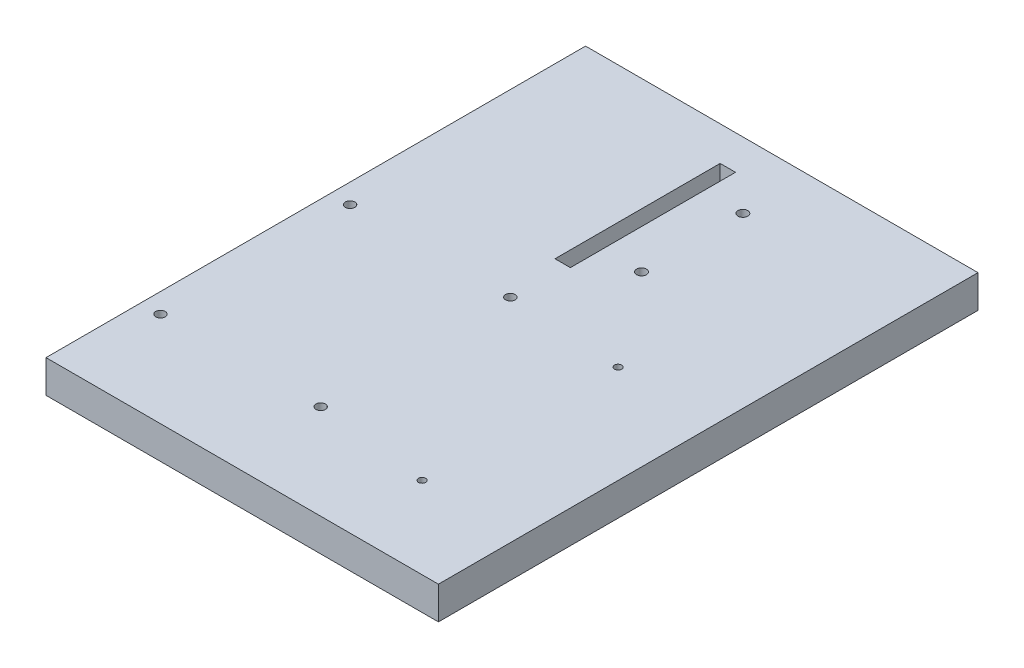
ISO-10303-21;
HEADER;
FILE_DESCRIPTION(('STEP AP214'),'2;1');
FILE_NAME('part.step','',(''),(''),'','','');
FILE_SCHEMA(('AUTOMOTIVE_DESIGN { 1 0 10303 214 1 1 1 1 }'));
ENDSEC;
DATA;
#1=APPLICATION_CONTEXT('core data for automotive mechanical design processes');
#2=APPLICATION_PROTOCOL_DEFINITION('international standard','automotive_design',2000,#1);
#3=PRODUCT_CONTEXT('',#1,'mechanical');
#4=PRODUCT('Part','Part','',(#3));
#5=PRODUCT_RELATED_PRODUCT_CATEGORY('part','',(#4));
#6=PRODUCT_DEFINITION_FORMATION('','',#4);
#7=PRODUCT_DEFINITION_CONTEXT('part definition',#1,'design');
#8=PRODUCT_DEFINITION('design','',#6,#7);
#9=PRODUCT_DEFINITION_SHAPE('','',#8);
#10=(LENGTH_UNIT() NAMED_UNIT(*) SI_UNIT(.MILLI.,.METRE.));
#11=(NAMED_UNIT(*) PLANE_ANGLE_UNIT() SI_UNIT($,.RADIAN.));
#12=(NAMED_UNIT(*) SI_UNIT($,.STERADIAN.) SOLID_ANGLE_UNIT());
#13=UNCERTAINTY_MEASURE_WITH_UNIT(LENGTH_MEASURE(1.E-05),#10,'distance_accuracy_value','');
#14=(GEOMETRIC_REPRESENTATION_CONTEXT(3) GLOBAL_UNCERTAINTY_ASSIGNED_CONTEXT((#13)) GLOBAL_UNIT_ASSIGNED_CONTEXT((#10,
#11,#12)) REPRESENTATION_CONTEXT('',''));
#15=CARTESIAN_POINT('',(0.,0.,0.));
#16=DIRECTION('',(0.,0.,1.));
#17=DIRECTION('',(1.,0.,0.));
#18=AXIS2_PLACEMENT_3D('',#15,#16,#17);
#19=CARTESIAN_POINT('',(0.,10.,0.));
#20=DIRECTION('',(1.,0.,0.));
#21=DIRECTION('',(0.,0.,-1.));
#22=AXIS2_PLACEMENT_3D('',#19,#20,#21);
#23=PLANE('',#22);
#24=DIRECTION('',(0.,0.,1.));
#25=VECTOR('',#24,1.);
#26=CARTESIAN_POINT('',(0.,0.,0.));
#27=LINE('',#26,#25);
#28=CARTESIAN_POINT('',(0.,0.,-165.));
#29=VERTEX_POINT('',#28);
#30=CARTESIAN_POINT('',(0.,0.,0.));
#31=VERTEX_POINT('',#30);
#32=EDGE_CURVE('E226',#29,#31,#27,.T.);
#33=ORIENTED_EDGE('',*,*,#32,.T.);
#34=DIRECTION('',(0.,-1.,0.));
#35=VECTOR('',#34,1.);
#36=CARTESIAN_POINT('',(0.,10.,0.));
#37=LINE('',#36,#35);
#38=CARTESIAN_POINT('',(0.,10.,0.));
#39=VERTEX_POINT('',#38);
#40=EDGE_CURVE('E11',#39,#31,#37,.T.);
#41=ORIENTED_EDGE('',*,*,#40,.F.);
#42=DIRECTION('',(0.,0.,1.));
#43=VECTOR('',#42,1.);
#44=CARTESIAN_POINT('',(0.,10.,0.));
#45=LINE('',#44,#43);
#46=CARTESIAN_POINT('',(0.,10.,-165.));
#47=VERTEX_POINT('',#46);
#48=EDGE_CURVE('E227',#47,#39,#45,.T.);
#49=ORIENTED_EDGE('',*,*,#48,.F.);
#50=DIRECTION('',(0.,-1.,0.));
#51=VECTOR('',#50,1.);
#52=CARTESIAN_POINT('',(0.,10.,-165.));
#53=LINE('',#52,#51);
#54=EDGE_CURVE('E237',#47,#29,#53,.T.);
#55=ORIENTED_EDGE('',*,*,#54,.T.);
#56=EDGE_LOOP('',(#33,#41,#49,#55));
#57=FACE_BOUND('',#56,.T.);
#58=ADVANCED_FACE('F35',(#57),#23,.F.);
#59=CARTESIAN_POINT('',(0.,10.,0.));
#60=DIRECTION('',(0.,0.,-1.));
#61=DIRECTION('',(-1.,0.,0.));
#62=AXIS2_PLACEMENT_3D('',#59,#60,#61);
#63=PLANE('',#62);
#64=DIRECTION('',(1.,0.,0.));
#65=VECTOR('',#64,1.);
#66=CARTESIAN_POINT('',(0.,0.,0.));
#67=LINE('',#66,#65);
#68=CARTESIAN_POINT('',(120.,0.,0.));
#69=VERTEX_POINT('',#68);
#70=EDGE_CURVE('E240',#31,#69,#67,.T.);
#71=ORIENTED_EDGE('',*,*,#70,.T.);
#72=DIRECTION('',(0.,-1.,0.));
#73=VECTOR('',#72,1.);
#74=CARTESIAN_POINT('',(120.,10.,0.));
#75=LINE('',#74,#73);
#76=CARTESIAN_POINT('',(120.,10.,0.));
#77=VERTEX_POINT('',#76);
#78=EDGE_CURVE('E42',#77,#69,#75,.T.);
#79=ORIENTED_EDGE('',*,*,#78,.F.);
#80=DIRECTION('',(1.,0.,0.));
#81=VECTOR('',#80,1.);
#82=CARTESIAN_POINT('',(0.,10.,0.));
#83=LINE('',#82,#81);
#84=EDGE_CURVE('E230',#39,#77,#83,.T.);
#85=ORIENTED_EDGE('',*,*,#84,.F.);
#86=ORIENTED_EDGE('',*,*,#40,.T.);
#87=EDGE_LOOP('',(#71,#79,#85,#86));
#88=FACE_BOUND('',#87,.T.);
#89=ADVANCED_FACE('F269',(#88),#63,.F.);
#90=CARTESIAN_POINT('',(120.,10.,0.));
#91=DIRECTION('',(-1.,0.,0.));
#92=DIRECTION('',(0.,0.,1.));
#93=AXIS2_PLACEMENT_3D('',#90,#91,#92);
#94=PLANE('',#93);
#95=DIRECTION('',(0.,0.,-1.));
#96=VECTOR('',#95,1.);
#97=CARTESIAN_POINT('',(120.,0.,0.));
#98=LINE('',#97,#96);
#99=CARTESIAN_POINT('',(120.,0.,-165.));
#100=VERTEX_POINT('',#99);
#101=EDGE_CURVE('E242',#69,#100,#98,.T.);
#102=ORIENTED_EDGE('',*,*,#101,.T.);
#103=DIRECTION('',(0.,-1.,0.));
#104=VECTOR('',#103,1.);
#105=CARTESIAN_POINT('',(120.,10.,-165.));
#106=LINE('',#105,#104);
#107=CARTESIAN_POINT('',(120.,10.,-165.));
#108=VERTEX_POINT('',#107);
#109=EDGE_CURVE('E247',#108,#100,#106,.T.);
#110=ORIENTED_EDGE('',*,*,#109,.F.);
#111=DIRECTION('',(0.,0.,-1.));
#112=VECTOR('',#111,1.);
#113=CARTESIAN_POINT('',(120.,10.,0.));
#114=LINE('',#113,#112);
#115=EDGE_CURVE('E233',#77,#108,#114,.T.);
#116=ORIENTED_EDGE('',*,*,#115,.F.);
#117=ORIENTED_EDGE('',*,*,#78,.T.);
#118=EDGE_LOOP('',(#102,#110,#116,#117));
#119=FACE_BOUND('',#118,.T.);
#120=ADVANCED_FACE('F254',(#119),#94,.F.);
#121=CARTESIAN_POINT('',(0.,10.,-165.));
#122=DIRECTION('',(0.,0.,1.));
#123=DIRECTION('',(1.,0.,0.));
#124=AXIS2_PLACEMENT_3D('',#121,#122,#123);
#125=PLANE('',#124);
#126=DIRECTION('',(-1.,0.,0.));
#127=VECTOR('',#126,1.);
#128=CARTESIAN_POINT('',(0.,0.,-165.));
#129=LINE('',#128,#127);
#130=EDGE_CURVE('E231',#100,#29,#129,.T.);
#131=ORIENTED_EDGE('',*,*,#130,.T.);
#132=ORIENTED_EDGE('',*,*,#54,.F.);
#133=DIRECTION('',(-1.,0.,0.));
#134=VECTOR('',#133,1.);
#135=CARTESIAN_POINT('',(0.,10.,-165.));
#136=LINE('',#135,#134);
#137=EDGE_CURVE('E235',#108,#47,#136,.T.);
#138=ORIENTED_EDGE('',*,*,#137,.F.);
#139=ORIENTED_EDGE('',*,*,#109,.T.);
#140=EDGE_LOOP('',(#131,#132,#138,#139));
#141=FACE_BOUND('',#140,.T.);
#142=ADVANCED_FACE('F262',(#141),#125,.F.);
#143=CARTESIAN_POINT('',(0.,10.,0.));
#144=DIRECTION('',(0.,-1.,0.));
#145=DIRECTION('',(0.,0.,-1.));
#146=AXIS2_PLACEMENT_3D('',#143,#144,#145);
#147=PLANE('',#146);
#148=CARTESIAN_POINT('',(68.35,10.,-144.75));
#149=DIRECTION('',(0.,1.,0.));
#150=DIRECTION('',(0.,0.,1.));
#151=AXIS2_PLACEMENT_3D('',#148,#149,#150);
#152=CIRCLE('',#151,1.5);
#153=CARTESIAN_POINT('',(68.35,10.,-143.25));
#154=VERTEX_POINT('',#153);
#155=EDGE_CURVE('E403',#154,#154,#152,.T.);
#156=ORIENTED_EDGE('',*,*,#155,.F.);
#157=EDGE_LOOP('',(#156));
#158=FACE_BOUND('',#157,.T.);
#159=CARTESIAN_POINT('',(68.35,10.,-113.75));
#160=DIRECTION('',(0.,1.,0.));
#161=DIRECTION('',(0.,0.,1.));
#162=AXIS2_PLACEMENT_3D('',#159,#160,#161);
#163=CIRCLE('',#162,1.5);
#164=CARTESIAN_POINT('',(68.35,10.,-112.25));
#165=VERTEX_POINT('',#164);
#166=EDGE_CURVE('E411',#165,#165,#163,.T.);
#167=ORIENTED_EDGE('',*,*,#166,.F.);
#168=EDGE_LOOP('',(#167));
#169=FACE_BOUND('',#168,.T.);
#170=DIRECTION('',(0.,0.,-1.));
#171=VECTOR('',#170,1.);
#172=CARTESIAN_POINT('',(56.35,10.,-154.5));
#173=LINE('',#172,#171);
#174=CARTESIAN_POINT('',(56.35,10.,-104.));
#175=VERTEX_POINT('',#174);
#176=CARTESIAN_POINT('',(56.35,10.,-154.5));
#177=VERTEX_POINT('',#176);
#178=EDGE_CURVE('E123',#175,#177,#173,.T.);
#179=ORIENTED_EDGE('',*,*,#178,.F.);
#180=DIRECTION('',(1.,0.,0.));
#181=VECTOR('',#180,1.);
#182=CARTESIAN_POINT('',(51.65,10.,-104.));
#183=LINE('',#182,#181);
#184=CARTESIAN_POINT('',(51.65,10.,-104.));
#185=VERTEX_POINT('',#184);
#186=EDGE_CURVE('E116',#185,#175,#183,.T.);
#187=ORIENTED_EDGE('',*,*,#186,.F.);
#188=DIRECTION('',(0.,0.,1.));
#189=VECTOR('',#188,1.);
#190=CARTESIAN_POINT('',(51.65,10.,-154.5));
#191=LINE('',#190,#189);
#192=CARTESIAN_POINT('',(51.65,10.,-154.5));
#193=VERTEX_POINT('',#192);
#194=EDGE_CURVE('E127',#193,#185,#191,.T.);
#195=ORIENTED_EDGE('',*,*,#194,.F.);
#196=DIRECTION('',(-1.,0.,0.));
#197=VECTOR('',#196,1.);
#198=CARTESIAN_POINT('',(51.65,10.,-154.5));
#199=LINE('',#198,#197);
#200=EDGE_CURVE('E49',#177,#193,#199,.T.);
#201=ORIENTED_EDGE('',*,*,#200,.F.);
#202=EDGE_LOOP('',(#179,#187,#195,#201));
#203=FACE_BOUND('',#202,.T.);
#204=CARTESIAN_POINT('',(90.,10.,-25.));
#205=DIRECTION('',(0.,-1.,0.));
#206=DIRECTION('',(0.,0.,-1.));
#207=AXIS2_PLACEMENT_3D('',#204,#205,#206);
#208=CIRCLE('',#207,1.1);
#209=CARTESIAN_POINT('',(90.,10.,-26.1));
#210=VERTEX_POINT('',#209);
#211=EDGE_CURVE('E148',#210,#210,#208,.T.);
#212=ORIENTED_EDGE('',*,*,#211,.T.);
#213=EDGE_LOOP('',(#212));
#214=FACE_BOUND('',#213,.T.);
#215=CARTESIAN_POINT('',(90.,10.,-84.95));
#216=DIRECTION('',(0.,-1.,0.));
#217=DIRECTION('',(0.,0.,-1.));
#218=AXIS2_PLACEMENT_3D('',#215,#216,#217);
#219=CIRCLE('',#218,1.1);
#220=CARTESIAN_POINT('',(90.,10.,-86.05));
#221=VERTEX_POINT('',#220);
#222=EDGE_CURVE('E163',#221,#221,#219,.T.);
#223=ORIENTED_EDGE('',*,*,#222,.T.);
#224=EDGE_LOOP('',(#223));
#225=FACE_BOUND('',#224,.T.);
#226=CARTESIAN_POINT('',(6.,10.,-29.));
#227=DIRECTION('',(0.,-1.,0.));
#228=DIRECTION('',(0.,0.,-1.));
#229=AXIS2_PLACEMENT_3D('',#226,#227,#228);
#230=CIRCLE('',#229,1.45);
#231=CARTESIAN_POINT('',(6.,10.,-30.45));
#232=VERTEX_POINT('',#231);
#233=EDGE_CURVE('E178',#232,#232,#230,.T.);
#234=ORIENTED_EDGE('',*,*,#233,.T.);
#235=EDGE_LOOP('',(#234));
#236=FACE_BOUND('',#235,.T.);
#237=CARTESIAN_POINT('',(55.,10.,-29.));
#238=DIRECTION('',(0.,-1.,0.));
#239=DIRECTION('',(0.,0.,-1.));
#240=AXIS2_PLACEMENT_3D('',#237,#238,#239);
#241=CIRCLE('',#240,1.45);
#242=CARTESIAN_POINT('',(55.,10.,-30.45));
#243=VERTEX_POINT('',#242);
#244=EDGE_CURVE('E193',#243,#243,#241,.T.);
#245=ORIENTED_EDGE('',*,*,#244,.T.);
#246=EDGE_LOOP('',(#245));
#247=FACE_BOUND('',#246,.T.);
#248=CARTESIAN_POINT('',(55.,10.,-87.));
#249=DIRECTION('',(0.,-1.,0.));
#250=DIRECTION('',(0.,0.,-1.));
#251=AXIS2_PLACEMENT_3D('',#248,#249,#250);
#252=CIRCLE('',#251,1.45);
#253=CARTESIAN_POINT('',(55.,10.,-88.45));
#254=VERTEX_POINT('',#253);
#255=EDGE_CURVE('E208',#254,#254,#252,.T.);
#256=ORIENTED_EDGE('',*,*,#255,.T.);
#257=EDGE_LOOP('',(#256));
#258=FACE_BOUND('',#257,.T.);
#259=CARTESIAN_POINT('',(5.99999999999999,10.,-87.));
#260=DIRECTION('',(0.,-1.,0.));
#261=DIRECTION('',(0.,0.,-1.));
#262=AXIS2_PLACEMENT_3D('',#259,#260,#261);
#263=CIRCLE('',#262,1.45);
#264=CARTESIAN_POINT('',(5.99999999999999,10.,-88.45));
#265=VERTEX_POINT('',#264);
#266=EDGE_CURVE('E223',#265,#265,#263,.T.);
#267=ORIENTED_EDGE('',*,*,#266,.T.);
#268=EDGE_LOOP('',(#267));
#269=FACE_BOUND('',#268,.T.);
#270=ORIENTED_EDGE('',*,*,#48,.T.);
#271=ORIENTED_EDGE('',*,*,#84,.T.);
#272=ORIENTED_EDGE('',*,*,#115,.T.);
#273=ORIENTED_EDGE('',*,*,#137,.T.);
#274=EDGE_LOOP('',(#270,#271,#272,#273));
#275=FACE_BOUND('',#274,.T.);
#276=ADVANCED_FACE('F268',(#158,#169,#203,#214,#225,#236,#247,#258,#269,#275),#147,.F.);
#277=CARTESIAN_POINT('',(0.,0.,0.));
#278=DIRECTION('',(0.,-1.,0.));
#279=DIRECTION('',(0.,0.,-1.));
#280=AXIS2_PLACEMENT_3D('',#277,#278,#279);
#281=PLANE('',#280);
#282=CARTESIAN_POINT('',(68.35,0.,-144.75));
#283=DIRECTION('',(0.,-1.,0.));
#284=DIRECTION('',(0.,0.,-1.));
#285=AXIS2_PLACEMENT_3D('',#282,#283,#284);
#286=CIRCLE('',#285,1.5);
#287=CARTESIAN_POINT('',(68.35,0.,-146.25));
#288=VERTEX_POINT('',#287);
#289=EDGE_CURVE('E406',#288,#288,#286,.F.);
#290=ORIENTED_EDGE('',*,*,#289,.T.);
#291=EDGE_LOOP('',(#290));
#292=FACE_BOUND('',#291,.T.);
#293=CARTESIAN_POINT('',(68.35,0.,-113.75));
#294=DIRECTION('',(0.,-1.,0.));
#295=DIRECTION('',(0.,0.,-1.));
#296=AXIS2_PLACEMENT_3D('',#293,#294,#295);
#297=CIRCLE('',#296,1.5);
#298=CARTESIAN_POINT('',(68.35,0.,-115.25));
#299=VERTEX_POINT('',#298);
#300=EDGE_CURVE('E408',#299,#299,#297,.F.);
#301=ORIENTED_EDGE('',*,*,#300,.T.);
#302=EDGE_LOOP('',(#301));
#303=FACE_BOUND('',#302,.T.);
#304=DIRECTION('',(1.,0.,0.));
#305=VECTOR('',#304,1.);
#306=CARTESIAN_POINT('',(51.65,0.,-104.));
#307=LINE('',#306,#305);
#308=CARTESIAN_POINT('',(51.65,0.,-104.));
#309=VERTEX_POINT('',#308);
#310=CARTESIAN_POINT('',(56.35,0.,-104.));
#311=VERTEX_POINT('',#310);
#312=EDGE_CURVE('E113',#309,#311,#307,.T.);
#313=ORIENTED_EDGE('',*,*,#312,.T.);
#314=DIRECTION('',(0.,0.,-1.));
#315=VECTOR('',#314,1.);
#316=CARTESIAN_POINT('',(56.35,0.,-154.5));
#317=LINE('',#316,#315);
#318=CARTESIAN_POINT('',(56.35,0.,-154.5));
#319=VERTEX_POINT('',#318);
#320=EDGE_CURVE('E100',#311,#319,#317,.T.);
#321=ORIENTED_EDGE('',*,*,#320,.T.);
#322=DIRECTION('',(-1.,0.,0.));
#323=VECTOR('',#322,1.);
#324=CARTESIAN_POINT('',(51.65,0.,-154.5));
#325=LINE('',#324,#323);
#326=CARTESIAN_POINT('',(51.65,0.,-154.5));
#327=VERTEX_POINT('',#326);
#328=EDGE_CURVE('E131',#319,#327,#325,.T.);
#329=ORIENTED_EDGE('',*,*,#328,.T.);
#330=DIRECTION('',(0.,0.,1.));
#331=VECTOR('',#330,1.);
#332=CARTESIAN_POINT('',(51.65,0.,-154.5));
#333=LINE('',#332,#331);
#334=EDGE_CURVE('E121',#327,#309,#333,.T.);
#335=ORIENTED_EDGE('',*,*,#334,.T.);
#336=EDGE_LOOP('',(#313,#321,#329,#335));
#337=FACE_BOUND('',#336,.T.);
#338=CARTESIAN_POINT('',(90.,0.,-25.));
#339=DIRECTION('',(0.,-1.,0.));
#340=DIRECTION('',(0.,0.,-1.));
#341=AXIS2_PLACEMENT_3D('',#338,#339,#340);
#342=CIRCLE('',#341,2.525);
#343=CARTESIAN_POINT('',(90.,0.,-27.525));
#344=VERTEX_POINT('',#343);
#345=EDGE_CURVE('E136',#344,#344,#342,.T.);
#346=ORIENTED_EDGE('',*,*,#345,.F.);
#347=EDGE_LOOP('',(#346));
#348=FACE_BOUND('',#347,.T.);
#349=CARTESIAN_POINT('',(90.,0.,-84.95));
#350=DIRECTION('',(0.,-1.,0.));
#351=DIRECTION('',(0.,0.,-1.));
#352=AXIS2_PLACEMENT_3D('',#349,#350,#351);
#353=CIRCLE('',#352,2.525);
#354=CARTESIAN_POINT('',(90.,0.,-87.475));
#355=VERTEX_POINT('',#354);
#356=EDGE_CURVE('E151',#355,#355,#353,.T.);
#357=ORIENTED_EDGE('',*,*,#356,.F.);
#358=EDGE_LOOP('',(#357));
#359=FACE_BOUND('',#358,.T.);
#360=CARTESIAN_POINT('',(6.,0.,-29.));
#361=DIRECTION('',(0.,-1.,0.));
#362=DIRECTION('',(0.,0.,-1.));
#363=AXIS2_PLACEMENT_3D('',#360,#361,#362);
#364=CIRCLE('',#363,3.025);
#365=CARTESIAN_POINT('',(6.,0.,-32.025));
#366=VERTEX_POINT('',#365);
#367=EDGE_CURVE('E166',#366,#366,#364,.T.);
#368=ORIENTED_EDGE('',*,*,#367,.F.);
#369=EDGE_LOOP('',(#368));
#370=FACE_BOUND('',#369,.T.);
#371=CARTESIAN_POINT('',(55.,0.,-29.));
#372=DIRECTION('',(0.,-1.,0.));
#373=DIRECTION('',(0.,0.,-1.));
#374=AXIS2_PLACEMENT_3D('',#371,#372,#373);
#375=CIRCLE('',#374,3.025);
#376=CARTESIAN_POINT('',(55.,0.,-32.025));
#377=VERTEX_POINT('',#376);
#378=EDGE_CURVE('E181',#377,#377,#375,.T.);
#379=ORIENTED_EDGE('',*,*,#378,.F.);
#380=EDGE_LOOP('',(#379));
#381=FACE_BOUND('',#380,.T.);
#382=CARTESIAN_POINT('',(55.,0.,-87.));
#383=DIRECTION('',(0.,-1.,0.));
#384=DIRECTION('',(0.,0.,-1.));
#385=AXIS2_PLACEMENT_3D('',#382,#383,#384);
#386=CIRCLE('',#385,3.025);
#387=CARTESIAN_POINT('',(55.,0.,-90.025));
#388=VERTEX_POINT('',#387);
#389=EDGE_CURVE('E196',#388,#388,#386,.T.);
#390=ORIENTED_EDGE('',*,*,#389,.F.);
#391=EDGE_LOOP('',(#390));
#392=FACE_BOUND('',#391,.T.);
#393=CARTESIAN_POINT('',(5.99999999999999,0.,-87.));
#394=DIRECTION('',(0.,-1.,0.));
#395=DIRECTION('',(0.,0.,-1.));
#396=AXIS2_PLACEMENT_3D('',#393,#394,#395);
#397=CIRCLE('',#396,3.025);
#398=CARTESIAN_POINT('',(5.99999999999999,0.,-90.025));
#399=VERTEX_POINT('',#398);
#400=EDGE_CURVE('E211',#399,#399,#397,.T.);
#401=ORIENTED_EDGE('',*,*,#400,.F.);
#402=EDGE_LOOP('',(#401));
#403=FACE_BOUND('',#402,.T.);
#404=ORIENTED_EDGE('',*,*,#32,.F.);
#405=ORIENTED_EDGE('',*,*,#130,.F.);
#406=ORIENTED_EDGE('',*,*,#101,.F.);
#407=ORIENTED_EDGE('',*,*,#70,.F.);
#408=EDGE_LOOP('',(#404,#405,#406,#407));
#409=FACE_BOUND('',#408,.T.);
#410=ADVANCED_FACE('F119',(#292,#303,#337,#348,#359,#370,#381,#392,#403,#409),#281,.T.);
#411=CARTESIAN_POINT('',(5.99999999999999,0.,-87.));
#412=DIRECTION('',(0.,-1.,0.));
#413=DIRECTION('',(0.,0.,-1.));
#414=AXIS2_PLACEMENT_3D('',#411,#412,#413);
#415=CYLINDRICAL_SURFACE('',#414,1.45);
#416=ORIENTED_EDGE('',*,*,#266,.F.);
#417=EDGE_LOOP('',(#416));
#418=FACE_BOUND('',#417,.T.);
#419=CARTESIAN_POINT('',(5.99999999999999,2.1,-87.));
#420=DIRECTION('',(0.,-1.,0.));
#421=DIRECTION('',(0.,0.,-1.));
#422=AXIS2_PLACEMENT_3D('',#419,#420,#421);
#423=CIRCLE('',#422,1.45);
#424=CARTESIAN_POINT('',(5.99999999999999,2.1,-88.45));
#425=VERTEX_POINT('',#424);
#426=EDGE_CURVE('E220',#425,#425,#423,.T.);
#427=ORIENTED_EDGE('',*,*,#426,.T.);
#428=EDGE_LOOP('',(#427));
#429=FACE_BOUND('',#428,.T.);
#430=ADVANCED_FACE('F281',(#418,#429),#415,.F.);
#431=CARTESIAN_POINT('',(8.99999999999999,2.1,-87.));
#432=DIRECTION('',(0.,1.,0.));
#433=DIRECTION('',(0.,0.,1.));
#434=AXIS2_PLACEMENT_3D('',#431,#432,#433);
#435=PLANE('',#434);
#436=ORIENTED_EDGE('',*,*,#426,.F.);
#437=EDGE_LOOP('',(#436));
#438=FACE_BOUND('',#437,.T.);
#439=CARTESIAN_POINT('',(5.99999999999999,2.1,-87.));
#440=DIRECTION('',(0.,-1.,0.));
#441=DIRECTION('',(0.,0.,-1.));
#442=AXIS2_PLACEMENT_3D('',#439,#440,#441);
#443=CIRCLE('',#442,3.);
#444=CARTESIAN_POINT('',(5.99999999999999,2.1,-90.));
#445=VERTEX_POINT('',#444);
#446=EDGE_CURVE('E217',#445,#445,#443,.T.);
#447=ORIENTED_EDGE('',*,*,#446,.T.);
#448=EDGE_LOOP('',(#447));
#449=FACE_BOUND('',#448,.T.);
#450=ADVANCED_FACE('F288',(#438,#449),#435,.F.);
#451=CARTESIAN_POINT('',(5.99999999999999,0.,-87.));
#452=DIRECTION('',(0.,-1.,0.));
#453=DIRECTION('',(0.,0.,-1.));
#454=AXIS2_PLACEMENT_3D('',#451,#452,#453);
#455=CYLINDRICAL_SURFACE('',#454,3.);
#456=ORIENTED_EDGE('',*,*,#446,.F.);
#457=EDGE_LOOP('',(#456));
#458=FACE_BOUND('',#457,.T.);
#459=CARTESIAN_POINT('',(5.99999999999999,0.0250000000000002,-87.));
#460=DIRECTION('',(0.,-1.,0.));
#461=DIRECTION('',(0.,0.,-1.));
#462=AXIS2_PLACEMENT_3D('',#459,#460,#461);
#463=CIRCLE('',#462,3.);
#464=CARTESIAN_POINT('',(5.99999999999999,0.0250000000000002,-90.));
#465=VERTEX_POINT('',#464);
#466=EDGE_CURVE('E214',#465,#465,#463,.T.);
#467=ORIENTED_EDGE('',*,*,#466,.T.);
#468=EDGE_LOOP('',(#467));
#469=FACE_BOUND('',#468,.T.);
#470=ADVANCED_FACE('F292',(#458,#469),#455,.F.);
#471=CARTESIAN_POINT('',(5.99999999999999,0.,-87.));
#472=DIRECTION('',(0.,-1.,0.));
#473=DIRECTION('',(0.,0.,-1.));
#474=AXIS2_PLACEMENT_3D('',#471,#472,#473);
#475=CONICAL_SURFACE('',#474,3.025,0.785398163397458);
#476=ORIENTED_EDGE('',*,*,#466,.F.);
#477=EDGE_LOOP('',(#476));
#478=FACE_BOUND('',#477,.T.);
#479=ORIENTED_EDGE('',*,*,#400,.T.);
#480=EDGE_LOOP('',(#479));
#481=FACE_BOUND('',#480,.T.);
#482=ADVANCED_FACE('F296',(#478,#481),#475,.F.);
#483=CARTESIAN_POINT('',(55.,0.,-87.));
#484=DIRECTION('',(0.,-1.,0.));
#485=DIRECTION('',(0.,0.,-1.));
#486=AXIS2_PLACEMENT_3D('',#483,#484,#485);
#487=CYLINDRICAL_SURFACE('',#486,1.45);
#488=ORIENTED_EDGE('',*,*,#255,.F.);
#489=EDGE_LOOP('',(#488));
#490=FACE_BOUND('',#489,.T.);
#491=CARTESIAN_POINT('',(55.,2.1,-87.));
#492=DIRECTION('',(0.,-1.,0.));
#493=DIRECTION('',(0.,0.,-1.));
#494=AXIS2_PLACEMENT_3D('',#491,#492,#493);
#495=CIRCLE('',#494,1.45);
#496=CARTESIAN_POINT('',(55.,2.1,-88.45));
#497=VERTEX_POINT('',#496);
#498=EDGE_CURVE('E205',#497,#497,#495,.T.);
#499=ORIENTED_EDGE('',*,*,#498,.T.);
#500=EDGE_LOOP('',(#499));
#501=FACE_BOUND('',#500,.T.);
#502=ADVANCED_FACE('F300',(#490,#501),#487,.F.);
#503=CARTESIAN_POINT('',(58.,2.1,-87.));
#504=DIRECTION('',(0.,1.,0.));
#505=DIRECTION('',(0.,0.,1.));
#506=AXIS2_PLACEMENT_3D('',#503,#504,#505);
#507=PLANE('',#506);
#508=ORIENTED_EDGE('',*,*,#498,.F.);
#509=EDGE_LOOP('',(#508));
#510=FACE_BOUND('',#509,.T.);
#511=CARTESIAN_POINT('',(55.,2.1,-87.));
#512=DIRECTION('',(0.,-1.,0.));
#513=DIRECTION('',(0.,0.,-1.));
#514=AXIS2_PLACEMENT_3D('',#511,#512,#513);
#515=CIRCLE('',#514,3.);
#516=CARTESIAN_POINT('',(55.,2.1,-90.));
#517=VERTEX_POINT('',#516);
#518=EDGE_CURVE('E202',#517,#517,#515,.T.);
#519=ORIENTED_EDGE('',*,*,#518,.T.);
#520=EDGE_LOOP('',(#519));
#521=FACE_BOUND('',#520,.T.);
#522=ADVANCED_FACE('F304',(#510,#521),#507,.F.);
#523=CARTESIAN_POINT('',(55.,0.,-87.));
#524=DIRECTION('',(0.,-1.,0.));
#525=DIRECTION('',(0.,0.,-1.));
#526=AXIS2_PLACEMENT_3D('',#523,#524,#525);
#527=CYLINDRICAL_SURFACE('',#526,3.);
#528=ORIENTED_EDGE('',*,*,#518,.F.);
#529=EDGE_LOOP('',(#528));
#530=FACE_BOUND('',#529,.T.);
#531=CARTESIAN_POINT('',(55.,0.0250000000000002,-87.));
#532=DIRECTION('',(0.,-1.,0.));
#533=DIRECTION('',(0.,0.,-1.));
#534=AXIS2_PLACEMENT_3D('',#531,#532,#533);
#535=CIRCLE('',#534,3.);
#536=CARTESIAN_POINT('',(55.,0.0250000000000002,-90.));
#537=VERTEX_POINT('',#536);
#538=EDGE_CURVE('E199',#537,#537,#535,.T.);
#539=ORIENTED_EDGE('',*,*,#538,.T.);
#540=EDGE_LOOP('',(#539));
#541=FACE_BOUND('',#540,.T.);
#542=ADVANCED_FACE('F308',(#530,#541),#527,.F.);
#543=CARTESIAN_POINT('',(55.,0.,-87.));
#544=DIRECTION('',(0.,-1.,0.));
#545=DIRECTION('',(0.,0.,-1.));
#546=AXIS2_PLACEMENT_3D('',#543,#544,#545);
#547=CONICAL_SURFACE('',#546,3.025,0.785398163397389);
#548=ORIENTED_EDGE('',*,*,#538,.F.);
#549=EDGE_LOOP('',(#548));
#550=FACE_BOUND('',#549,.T.);
#551=ORIENTED_EDGE('',*,*,#389,.T.);
#552=EDGE_LOOP('',(#551));
#553=FACE_BOUND('',#552,.T.);
#554=ADVANCED_FACE('F312',(#550,#553),#547,.F.);
#555=CARTESIAN_POINT('',(55.,0.,-29.));
#556=DIRECTION('',(0.,-1.,0.));
#557=DIRECTION('',(0.,0.,-1.));
#558=AXIS2_PLACEMENT_3D('',#555,#556,#557);
#559=CYLINDRICAL_SURFACE('',#558,1.45);
#560=ORIENTED_EDGE('',*,*,#244,.F.);
#561=EDGE_LOOP('',(#560));
#562=FACE_BOUND('',#561,.T.);
#563=CARTESIAN_POINT('',(55.,2.1,-29.));
#564=DIRECTION('',(0.,-1.,0.));
#565=DIRECTION('',(0.,0.,-1.));
#566=AXIS2_PLACEMENT_3D('',#563,#564,#565);
#567=CIRCLE('',#566,1.45);
#568=CARTESIAN_POINT('',(55.,2.1,-30.45));
#569=VERTEX_POINT('',#568);
#570=EDGE_CURVE('E190',#569,#569,#567,.T.);
#571=ORIENTED_EDGE('',*,*,#570,.T.);
#572=EDGE_LOOP('',(#571));
#573=FACE_BOUND('',#572,.T.);
#574=ADVANCED_FACE('F316',(#562,#573),#559,.F.);
#575=CARTESIAN_POINT('',(58.,2.1,-29.));
#576=DIRECTION('',(0.,1.,0.));
#577=DIRECTION('',(0.,0.,1.));
#578=AXIS2_PLACEMENT_3D('',#575,#576,#577);
#579=PLANE('',#578);
#580=ORIENTED_EDGE('',*,*,#570,.F.);
#581=EDGE_LOOP('',(#580));
#582=FACE_BOUND('',#581,.T.);
#583=CARTESIAN_POINT('',(55.,2.1,-29.));
#584=DIRECTION('',(0.,-1.,0.));
#585=DIRECTION('',(0.,0.,-1.));
#586=AXIS2_PLACEMENT_3D('',#583,#584,#585);
#587=CIRCLE('',#586,3.);
#588=CARTESIAN_POINT('',(55.,2.1,-32.));
#589=VERTEX_POINT('',#588);
#590=EDGE_CURVE('E187',#589,#589,#587,.T.);
#591=ORIENTED_EDGE('',*,*,#590,.T.);
#592=EDGE_LOOP('',(#591));
#593=FACE_BOUND('',#592,.T.);
#594=ADVANCED_FACE('F320',(#582,#593),#579,.F.);
#595=CARTESIAN_POINT('',(55.,0.,-29.));
#596=DIRECTION('',(0.,-1.,0.));
#597=DIRECTION('',(0.,0.,-1.));
#598=AXIS2_PLACEMENT_3D('',#595,#596,#597);
#599=CYLINDRICAL_SURFACE('',#598,3.);
#600=ORIENTED_EDGE('',*,*,#590,.F.);
#601=EDGE_LOOP('',(#600));
#602=FACE_BOUND('',#601,.T.);
#603=CARTESIAN_POINT('',(55.,0.0250000000000002,-29.));
#604=DIRECTION('',(0.,-1.,0.));
#605=DIRECTION('',(0.,0.,-1.));
#606=AXIS2_PLACEMENT_3D('',#603,#604,#605);
#607=CIRCLE('',#606,3.);
#608=CARTESIAN_POINT('',(55.,0.0250000000000002,-32.));
#609=VERTEX_POINT('',#608);
#610=EDGE_CURVE('E184',#609,#609,#607,.T.);
#611=ORIENTED_EDGE('',*,*,#610,.T.);
#612=EDGE_LOOP('',(#611));
#613=FACE_BOUND('',#612,.T.);
#614=ADVANCED_FACE('F324',(#602,#613),#599,.F.);
#615=CARTESIAN_POINT('',(55.,0.,-29.));
#616=DIRECTION('',(0.,-1.,0.));
#617=DIRECTION('',(0.,0.,-1.));
#618=AXIS2_PLACEMENT_3D('',#615,#616,#617);
#619=CONICAL_SURFACE('',#618,3.025,0.785398163397389);
#620=ORIENTED_EDGE('',*,*,#610,.F.);
#621=EDGE_LOOP('',(#620));
#622=FACE_BOUND('',#621,.T.);
#623=ORIENTED_EDGE('',*,*,#378,.T.);
#624=EDGE_LOOP('',(#623));
#625=FACE_BOUND('',#624,.T.);
#626=ADVANCED_FACE('F328',(#622,#625),#619,.F.);
#627=CARTESIAN_POINT('',(6.,0.,-29.));
#628=DIRECTION('',(0.,-1.,0.));
#629=DIRECTION('',(0.,0.,-1.));
#630=AXIS2_PLACEMENT_3D('',#627,#628,#629);
#631=CYLINDRICAL_SURFACE('',#630,1.45);
#632=ORIENTED_EDGE('',*,*,#233,.F.);
#633=EDGE_LOOP('',(#632));
#634=FACE_BOUND('',#633,.T.);
#635=CARTESIAN_POINT('',(6.,2.1,-29.));
#636=DIRECTION('',(0.,-1.,0.));
#637=DIRECTION('',(0.,0.,-1.));
#638=AXIS2_PLACEMENT_3D('',#635,#636,#637);
#639=CIRCLE('',#638,1.45);
#640=CARTESIAN_POINT('',(6.,2.1,-30.45));
#641=VERTEX_POINT('',#640);
#642=EDGE_CURVE('E175',#641,#641,#639,.T.);
#643=ORIENTED_EDGE('',*,*,#642,.T.);
#644=EDGE_LOOP('',(#643));
#645=FACE_BOUND('',#644,.T.);
#646=ADVANCED_FACE('F332',(#634,#645),#631,.F.);
#647=CARTESIAN_POINT('',(9.,2.1,-29.));
#648=DIRECTION('',(0.,1.,0.));
#649=DIRECTION('',(0.,0.,1.));
#650=AXIS2_PLACEMENT_3D('',#647,#648,#649);
#651=PLANE('',#650);
#652=ORIENTED_EDGE('',*,*,#642,.F.);
#653=EDGE_LOOP('',(#652));
#654=FACE_BOUND('',#653,.T.);
#655=CARTESIAN_POINT('',(6.,2.1,-29.));
#656=DIRECTION('',(0.,-1.,0.));
#657=DIRECTION('',(0.,0.,-1.));
#658=AXIS2_PLACEMENT_3D('',#655,#656,#657);
#659=CIRCLE('',#658,3.);
#660=CARTESIAN_POINT('',(6.,2.1,-32.));
#661=VERTEX_POINT('',#660);
#662=EDGE_CURVE('E172',#661,#661,#659,.T.);
#663=ORIENTED_EDGE('',*,*,#662,.T.);
#664=EDGE_LOOP('',(#663));
#665=FACE_BOUND('',#664,.T.);
#666=ADVANCED_FACE('F336',(#654,#665),#651,.F.);
#667=CARTESIAN_POINT('',(6.,0.,-29.));
#668=DIRECTION('',(0.,-1.,0.));
#669=DIRECTION('',(0.,0.,-1.));
#670=AXIS2_PLACEMENT_3D('',#667,#668,#669);
#671=CYLINDRICAL_SURFACE('',#670,3.);
#672=ORIENTED_EDGE('',*,*,#662,.F.);
#673=EDGE_LOOP('',(#672));
#674=FACE_BOUND('',#673,.T.);
#675=CARTESIAN_POINT('',(6.,0.0250000000000002,-29.));
#676=DIRECTION('',(0.,-1.,0.));
#677=DIRECTION('',(0.,0.,-1.));
#678=AXIS2_PLACEMENT_3D('',#675,#676,#677);
#679=CIRCLE('',#678,3.);
#680=CARTESIAN_POINT('',(6.,0.0250000000000002,-32.));
#681=VERTEX_POINT('',#680);
#682=EDGE_CURVE('E169',#681,#681,#679,.T.);
#683=ORIENTED_EDGE('',*,*,#682,.T.);
#684=EDGE_LOOP('',(#683));
#685=FACE_BOUND('',#684,.T.);
#686=ADVANCED_FACE('F340',(#674,#685),#671,.F.);
#687=CARTESIAN_POINT('',(6.,0.,-29.));
#688=DIRECTION('',(0.,-1.,0.));
#689=DIRECTION('',(0.,0.,-1.));
#690=AXIS2_PLACEMENT_3D('',#687,#688,#689);
#691=CONICAL_SURFACE('',#690,3.025,0.785398163397458);
#692=ORIENTED_EDGE('',*,*,#682,.F.);
#693=EDGE_LOOP('',(#692));
#694=FACE_BOUND('',#693,.T.);
#695=ORIENTED_EDGE('',*,*,#367,.T.);
#696=EDGE_LOOP('',(#695));
#697=FACE_BOUND('',#696,.T.);
#698=ADVANCED_FACE('F344',(#694,#697),#691,.F.);
#699=CARTESIAN_POINT('',(90.,0.,-84.95));
#700=DIRECTION('',(0.,-1.,0.));
#701=DIRECTION('',(0.,0.,-1.));
#702=AXIS2_PLACEMENT_3D('',#699,#700,#701);
#703=CYLINDRICAL_SURFACE('',#702,1.1);
#704=ORIENTED_EDGE('',*,*,#222,.F.);
#705=EDGE_LOOP('',(#704));
#706=FACE_BOUND('',#705,.T.);
#707=CARTESIAN_POINT('',(90.,1.6,-84.95));
#708=DIRECTION('',(0.,-1.,0.));
#709=DIRECTION('',(0.,0.,-1.));
#710=AXIS2_PLACEMENT_3D('',#707,#708,#709);
#711=CIRCLE('',#710,1.1);
#712=CARTESIAN_POINT('',(90.,1.6,-86.05));
#713=VERTEX_POINT('',#712);
#714=EDGE_CURVE('E160',#713,#713,#711,.T.);
#715=ORIENTED_EDGE('',*,*,#714,.T.);
#716=EDGE_LOOP('',(#715));
#717=FACE_BOUND('',#716,.T.);
#718=ADVANCED_FACE('F348',(#706,#717),#703,.F.);
#719=CARTESIAN_POINT('',(92.5,1.6,-84.95));
#720=DIRECTION('',(0.,1.,0.));
#721=DIRECTION('',(0.,0.,1.));
#722=AXIS2_PLACEMENT_3D('',#719,#720,#721);
#723=PLANE('',#722);
#724=ORIENTED_EDGE('',*,*,#714,.F.);
#725=EDGE_LOOP('',(#724));
#726=FACE_BOUND('',#725,.T.);
#727=CARTESIAN_POINT('',(90.,1.6,-84.95));
#728=DIRECTION('',(0.,-1.,0.));
#729=DIRECTION('',(0.,0.,-1.));
#730=AXIS2_PLACEMENT_3D('',#727,#728,#729);
#731=CIRCLE('',#730,2.5);
#732=CARTESIAN_POINT('',(90.,1.6,-87.45));
#733=VERTEX_POINT('',#732);
#734=EDGE_CURVE('E157',#733,#733,#731,.T.);
#735=ORIENTED_EDGE('',*,*,#734,.T.);
#736=EDGE_LOOP('',(#735));
#737=FACE_BOUND('',#736,.T.);
#738=ADVANCED_FACE('F352',(#726,#737),#723,.F.);
#739=CARTESIAN_POINT('',(90.,0.,-84.95));
#740=DIRECTION('',(0.,-1.,0.));
#741=DIRECTION('',(0.,0.,-1.));
#742=AXIS2_PLACEMENT_3D('',#739,#740,#741);
#743=CYLINDRICAL_SURFACE('',#742,2.5);
#744=ORIENTED_EDGE('',*,*,#734,.F.);
#745=EDGE_LOOP('',(#744));
#746=FACE_BOUND('',#745,.T.);
#747=CARTESIAN_POINT('',(90.,0.0250000000000006,-84.95));
#748=DIRECTION('',(0.,-1.,0.));
#749=DIRECTION('',(0.,0.,-1.));
#750=AXIS2_PLACEMENT_3D('',#747,#748,#749);
#751=CIRCLE('',#750,2.5);
#752=CARTESIAN_POINT('',(90.,0.0250000000000006,-87.45));
#753=VERTEX_POINT('',#752);
#754=EDGE_CURVE('E154',#753,#753,#751,.T.);
#755=ORIENTED_EDGE('',*,*,#754,.T.);
#756=EDGE_LOOP('',(#755));
#757=FACE_BOUND('',#756,.T.);
#758=ADVANCED_FACE('F356',(#746,#757),#743,.F.);
#759=CARTESIAN_POINT('',(90.,0.,-84.95));
#760=DIRECTION('',(0.,-1.,0.));
#761=DIRECTION('',(0.,0.,-1.));
#762=AXIS2_PLACEMENT_3D('',#759,#760,#761);
#763=CONICAL_SURFACE('',#762,2.525,0.78539816339738);
#764=ORIENTED_EDGE('',*,*,#754,.F.);
#765=EDGE_LOOP('',(#764));
#766=FACE_BOUND('',#765,.T.);
#767=ORIENTED_EDGE('',*,*,#356,.T.);
#768=EDGE_LOOP('',(#767));
#769=FACE_BOUND('',#768,.T.);
#770=ADVANCED_FACE('F360',(#766,#769),#763,.F.);
#771=CARTESIAN_POINT('',(90.,0.,-25.));
#772=DIRECTION('',(0.,-1.,0.));
#773=DIRECTION('',(0.,0.,-1.));
#774=AXIS2_PLACEMENT_3D('',#771,#772,#773);
#775=CYLINDRICAL_SURFACE('',#774,1.1);
#776=ORIENTED_EDGE('',*,*,#211,.F.);
#777=EDGE_LOOP('',(#776));
#778=FACE_BOUND('',#777,.T.);
#779=CARTESIAN_POINT('',(90.,1.6,-25.));
#780=DIRECTION('',(0.,-1.,0.));
#781=DIRECTION('',(0.,0.,-1.));
#782=AXIS2_PLACEMENT_3D('',#779,#780,#781);
#783=CIRCLE('',#782,1.1);
#784=CARTESIAN_POINT('',(90.,1.6,-26.1));
#785=VERTEX_POINT('',#784);
#786=EDGE_CURVE('E145',#785,#785,#783,.T.);
#787=ORIENTED_EDGE('',*,*,#786,.T.);
#788=EDGE_LOOP('',(#787));
#789=FACE_BOUND('',#788,.T.);
#790=ADVANCED_FACE('F364',(#778,#789),#775,.F.);
#791=CARTESIAN_POINT('',(92.5,1.6,-25.));
#792=DIRECTION('',(0.,1.,0.));
#793=DIRECTION('',(0.,0.,1.));
#794=AXIS2_PLACEMENT_3D('',#791,#792,#793);
#795=PLANE('',#794);
#796=ORIENTED_EDGE('',*,*,#786,.F.);
#797=EDGE_LOOP('',(#796));
#798=FACE_BOUND('',#797,.T.);
#799=CARTESIAN_POINT('',(90.,1.6,-25.));
#800=DIRECTION('',(0.,-1.,0.));
#801=DIRECTION('',(0.,0.,-1.));
#802=AXIS2_PLACEMENT_3D('',#799,#800,#801);
#803=CIRCLE('',#802,2.5);
#804=CARTESIAN_POINT('',(90.,1.6,-27.5));
#805=VERTEX_POINT('',#804);
#806=EDGE_CURVE('E142',#805,#805,#803,.T.);
#807=ORIENTED_EDGE('',*,*,#806,.T.);
#808=EDGE_LOOP('',(#807));
#809=FACE_BOUND('',#808,.T.);
#810=ADVANCED_FACE('F368',(#798,#809),#795,.F.);
#811=CARTESIAN_POINT('',(90.,0.,-25.));
#812=DIRECTION('',(0.,-1.,0.));
#813=DIRECTION('',(0.,0.,-1.));
#814=AXIS2_PLACEMENT_3D('',#811,#812,#813);
#815=CYLINDRICAL_SURFACE('',#814,2.5);
#816=ORIENTED_EDGE('',*,*,#806,.F.);
#817=EDGE_LOOP('',(#816));
#818=FACE_BOUND('',#817,.T.);
#819=CARTESIAN_POINT('',(90.,0.0250000000000006,-25.));
#820=DIRECTION('',(0.,-1.,0.));
#821=DIRECTION('',(0.,0.,-1.));
#822=AXIS2_PLACEMENT_3D('',#819,#820,#821);
#823=CIRCLE('',#822,2.5);
#824=CARTESIAN_POINT('',(90.,0.0250000000000006,-27.5));
#825=VERTEX_POINT('',#824);
#826=EDGE_CURVE('E139',#825,#825,#823,.T.);
#827=ORIENTED_EDGE('',*,*,#826,.T.);
#828=EDGE_LOOP('',(#827));
#829=FACE_BOUND('',#828,.T.);
#830=ADVANCED_FACE('F372',(#818,#829),#815,.F.);
#831=CARTESIAN_POINT('',(90.,0.,-25.));
#832=DIRECTION('',(0.,-1.,0.));
#833=DIRECTION('',(0.,0.,-1.));
#834=AXIS2_PLACEMENT_3D('',#831,#832,#833);
#835=CONICAL_SURFACE('',#834,2.525,0.78539816339738);
#836=ORIENTED_EDGE('',*,*,#826,.F.);
#837=EDGE_LOOP('',(#836));
#838=FACE_BOUND('',#837,.T.);
#839=ORIENTED_EDGE('',*,*,#345,.T.);
#840=EDGE_LOOP('',(#839));
#841=FACE_BOUND('',#840,.T.);
#842=ADVANCED_FACE('F376',(#838,#841),#835,.F.);
#843=CARTESIAN_POINT('',(51.65,-50.7182412944298,-104.));
#844=DIRECTION('',(0.,0.,1.));
#845=DIRECTION('',(1.,0.,0.));
#846=AXIS2_PLACEMENT_3D('',#843,#844,#845);
#847=PLANE('',#846);
#848=DIRECTION('',(0.,1.,0.));
#849=VECTOR('',#848,1.);
#850=CARTESIAN_POINT('',(51.65,-50.7182412944298,-104.));
#851=LINE('',#850,#849);
#852=EDGE_CURVE('E57',#309,#185,#851,.T.);
#853=ORIENTED_EDGE('',*,*,#852,.T.);
#854=ORIENTED_EDGE('',*,*,#186,.T.);
#855=DIRECTION('',(0.,1.,0.));
#856=VECTOR('',#855,1.);
#857=CARTESIAN_POINT('',(56.35,-50.7182412944298,-104.));
#858=LINE('',#857,#856);
#859=EDGE_CURVE('E104',#311,#175,#858,.T.);
#860=ORIENTED_EDGE('',*,*,#859,.F.);
#861=ORIENTED_EDGE('',*,*,#312,.F.);
#862=EDGE_LOOP('',(#853,#854,#860,#861));
#863=FACE_BOUND('',#862,.T.);
#864=ADVANCED_FACE('F112',(#863),#847,.F.);
#865=CARTESIAN_POINT('',(56.35,-50.7182412944298,-154.5));
#866=DIRECTION('',(1.,0.,0.));
#867=DIRECTION('',(0.,0.,-1.));
#868=AXIS2_PLACEMENT_3D('',#865,#866,#867);
#869=PLANE('',#868);
#870=ORIENTED_EDGE('',*,*,#859,.T.);
#871=ORIENTED_EDGE('',*,*,#178,.T.);
#872=DIRECTION('',(0.,1.,0.));
#873=VECTOR('',#872,1.);
#874=CARTESIAN_POINT('',(56.35,-50.7182412944298,-154.5));
#875=LINE('',#874,#873);
#876=EDGE_CURVE('E106',#319,#177,#875,.T.);
#877=ORIENTED_EDGE('',*,*,#876,.F.);
#878=ORIENTED_EDGE('',*,*,#320,.F.);
#879=EDGE_LOOP('',(#870,#871,#877,#878));
#880=FACE_BOUND('',#879,.T.);
#881=ADVANCED_FACE('F102',(#880),#869,.F.);
#882=CARTESIAN_POINT('',(51.65,-50.7182412944298,-154.5));
#883=DIRECTION('',(0.,0.,-1.));
#884=DIRECTION('',(-1.,0.,0.));
#885=AXIS2_PLACEMENT_3D('',#882,#883,#884);
#886=PLANE('',#885);
#887=ORIENTED_EDGE('',*,*,#876,.T.);
#888=ORIENTED_EDGE('',*,*,#200,.T.);
#889=DIRECTION('',(0.,1.,0.));
#890=VECTOR('',#889,1.);
#891=CARTESIAN_POINT('',(51.65,-50.7182412944298,-154.5));
#892=LINE('',#891,#890);
#893=EDGE_CURVE('E130',#327,#193,#892,.T.);
#894=ORIENTED_EDGE('',*,*,#893,.F.);
#895=ORIENTED_EDGE('',*,*,#328,.F.);
#896=EDGE_LOOP('',(#887,#888,#894,#895));
#897=FACE_BOUND('',#896,.T.);
#898=ADVANCED_FACE('F385',(#897),#886,.F.);
#899=CARTESIAN_POINT('',(51.65,-50.7182412944298,-154.5));
#900=DIRECTION('',(-1.,0.,0.));
#901=DIRECTION('',(0.,0.,1.));
#902=AXIS2_PLACEMENT_3D('',#899,#900,#901);
#903=PLANE('',#902);
#904=ORIENTED_EDGE('',*,*,#893,.T.);
#905=ORIENTED_EDGE('',*,*,#194,.T.);
#906=ORIENTED_EDGE('',*,*,#852,.F.);
#907=ORIENTED_EDGE('',*,*,#334,.F.);
#908=EDGE_LOOP('',(#904,#905,#906,#907));
#909=FACE_BOUND('',#908,.T.);
#910=ADVANCED_FACE('F388',(#909),#903,.F.);
#911=CARTESIAN_POINT('',(68.35,-4.24264068711929,-113.75));
#912=DIRECTION('',(0.,1.,0.));
#913=DIRECTION('',(0.,0.,1.));
#914=AXIS2_PLACEMENT_3D('',#911,#912,#913);
#915=CYLINDRICAL_SURFACE('',#914,1.5);
#916=ORIENTED_EDGE('',*,*,#166,.T.);
#917=EDGE_LOOP('',(#916));
#918=FACE_BOUND('',#917,.T.);
#919=ORIENTED_EDGE('',*,*,#300,.F.);
#920=EDGE_LOOP('',(#919));
#921=FACE_BOUND('',#920,.T.);
#922=ADVANCED_FACE('F391',(#918,#921),#915,.F.);
#923=CARTESIAN_POINT('',(68.35,-4.24264068711929,-144.75));
#924=DIRECTION('',(0.,1.,0.));
#925=DIRECTION('',(0.,0.,1.));
#926=AXIS2_PLACEMENT_3D('',#923,#924,#925);
#927=CYLINDRICAL_SURFACE('',#926,1.5);
#928=ORIENTED_EDGE('',*,*,#155,.T.);
#929=EDGE_LOOP('',(#928));
#930=FACE_BOUND('',#929,.T.);
#931=ORIENTED_EDGE('',*,*,#289,.F.);
#932=EDGE_LOOP('',(#931));
#933=FACE_BOUND('',#932,.T.);
#934=ADVANCED_FACE('F394',(#930,#933),#927,.F.);
#935=CLOSED_SHELL('',(#58,#89,#120,#142,#276,#410,#430,#450,#470,#482,#502,#522,#542,#554,#574,
#594,#614,#626,#646,#666,#686,#698,#718,#738,#758,#770,#790,#810,#830,#842,#864,#881,#898,#910,
#922,#934));
#936=MANIFOLD_SOLID_BREP('B2',#935);
#937=ADVANCED_BREP_SHAPE_REPRESENTATION('',(#18,#936),#14);
#938=SHAPE_DEFINITION_REPRESENTATION(#9,#937);
ENDSEC;
END-ISO-10303-21;
